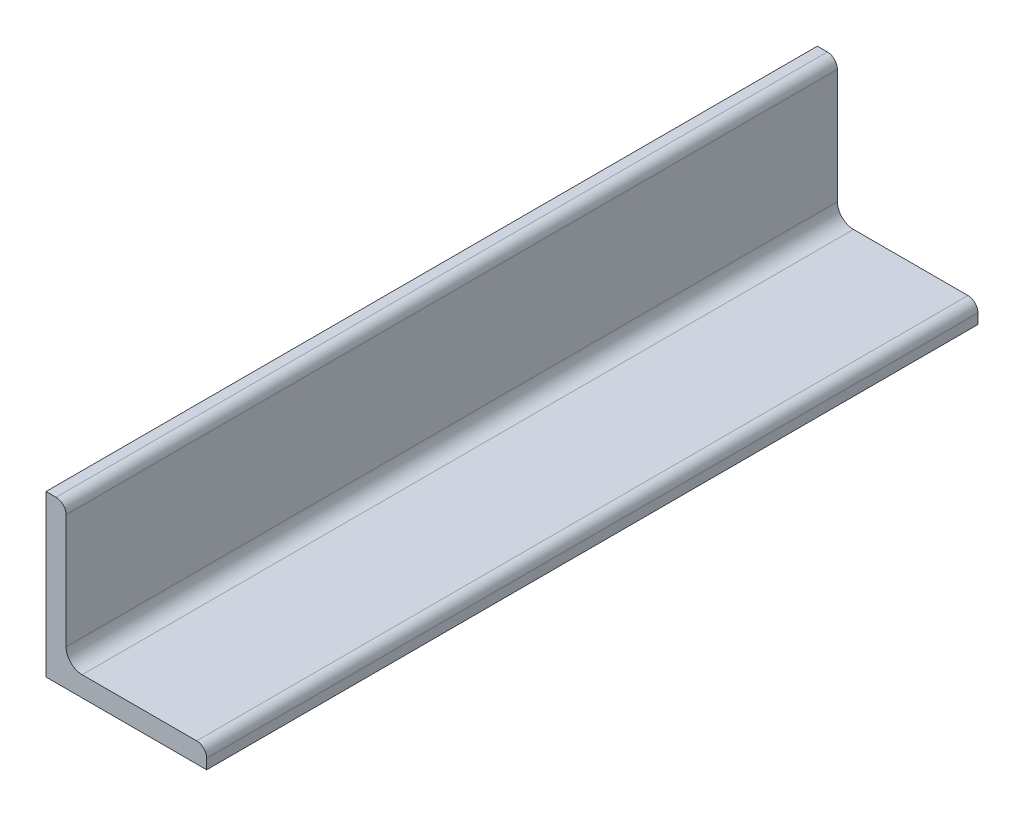
ISO-10303-21;
HEADER;
FILE_DESCRIPTION(('STEP AP214'),'2;1');
FILE_NAME('part.step','',(''),(''),'','','');
FILE_SCHEMA(('AUTOMOTIVE_DESIGN { 1 0 10303 214 1 1 1 1 }'));
ENDSEC;
DATA;
#1=APPLICATION_CONTEXT('core data for automotive mechanical design processes');
#2=APPLICATION_PROTOCOL_DEFINITION('international standard','automotive_design',2000,#1);
#3=PRODUCT_CONTEXT('',#1,'mechanical');
#4=PRODUCT('Part','Part','',(#3));
#5=PRODUCT_RELATED_PRODUCT_CATEGORY('part','',(#4));
#6=PRODUCT_DEFINITION_FORMATION('','',#4);
#7=PRODUCT_DEFINITION_CONTEXT('part definition',#1,'design');
#8=PRODUCT_DEFINITION('design','',#6,#7);
#9=PRODUCT_DEFINITION_SHAPE('','',#8);
#10=(LENGTH_UNIT() NAMED_UNIT(*) SI_UNIT(.MILLI.,.METRE.));
#11=(NAMED_UNIT(*) PLANE_ANGLE_UNIT() SI_UNIT($,.RADIAN.));
#12=(NAMED_UNIT(*) SI_UNIT($,.STERADIAN.) SOLID_ANGLE_UNIT());
#13=UNCERTAINTY_MEASURE_WITH_UNIT(LENGTH_MEASURE(1.E-05),#10,'distance_accuracy_value','');
#14=(GEOMETRIC_REPRESENTATION_CONTEXT(3) GLOBAL_UNCERTAINTY_ASSIGNED_CONTEXT((#13)) GLOBAL_UNIT_ASSIGNED_CONTEXT((#10,
#11,#12)) REPRESENTATION_CONTEXT('',''));
#15=CARTESIAN_POINT('',(0.,0.,0.));
#16=DIRECTION('',(0.,0.,1.));
#17=DIRECTION('',(1.,0.,0.));
#18=AXIS2_PLACEMENT_3D('',#15,#16,#17);
#19=CARTESIAN_POINT('',(0.897927251325018,63.8534276781816,304.8));
#20=DIRECTION('',(1.,0.,0.));
#21=DIRECTION('',(0.,0.,-1.));
#22=AXIS2_PLACEMENT_3D('',#19,#20,#21);
#23=PLANE('',#22);
#24=DIRECTION('',(0.,-1.,0.));
#25=VECTOR('',#24,1.);
#26=CARTESIAN_POINT('',(0.897927251325018,63.8534276781816,0.));
#27=LINE('',#26,#25);
#28=CARTESIAN_POINT('',(0.897927251325018,63.8534276781816,0.));
#29=VERTEX_POINT('',#28);
#30=CARTESIAN_POINT('',(0.897927251325018,0.353427678181561,0.));
#31=VERTEX_POINT('',#30);
#32=EDGE_CURVE('E135',#29,#31,#27,.T.);
#33=ORIENTED_EDGE('',*,*,#32,.T.);
#34=DIRECTION('',(0.,0.,-1.));
#35=VECTOR('',#34,1.);
#36=CARTESIAN_POINT('',(0.897927251325018,0.353427678181561,304.8));
#37=LINE('',#36,#35);
#38=CARTESIAN_POINT('',(0.897927251325018,0.353427678181561,304.8));
#39=VERTEX_POINT('',#38);
#40=EDGE_CURVE('E11',#39,#31,#37,.T.);
#41=ORIENTED_EDGE('',*,*,#40,.F.);
#42=DIRECTION('',(0.,-1.,0.));
#43=VECTOR('',#42,1.);
#44=CARTESIAN_POINT('',(0.897927251325018,63.8534276781816,304.8));
#45=LINE('',#44,#43);
#46=CARTESIAN_POINT('',(0.897927251325018,63.8534276781816,304.8));
#47=VERTEX_POINT('',#46);
#48=EDGE_CURVE('E151',#47,#39,#45,.T.);
#49=ORIENTED_EDGE('',*,*,#48,.F.);
#50=DIRECTION('',(0.,0.,-1.));
#51=VECTOR('',#50,1.);
#52=CARTESIAN_POINT('',(0.897927251325018,63.8534276781816,304.8));
#53=LINE('',#52,#51);
#54=EDGE_CURVE('E131',#47,#29,#53,.T.);
#55=ORIENTED_EDGE('',*,*,#54,.T.);
#56=EDGE_LOOP('',(#33,#41,#49,#55));
#57=FACE_BOUND('',#56,.T.);
#58=ADVANCED_FACE('F33',(#57),#23,.F.);
#59=CARTESIAN_POINT('',(0.897927251325018,0.353427678181561,304.8));
#60=DIRECTION('',(0.,1.,0.));
#61=DIRECTION('',(0.,0.,1.));
#62=AXIS2_PLACEMENT_3D('',#59,#60,#61);
#63=PLANE('',#62);
#64=DIRECTION('',(1.,0.,0.));
#65=VECTOR('',#64,1.);
#66=CARTESIAN_POINT('',(0.897927251325018,0.353427678181561,0.));
#67=LINE('',#66,#65);
#68=CARTESIAN_POINT('',(64.397927251325,0.353427678181561,0.));
#69=VERTEX_POINT('',#68);
#70=EDGE_CURVE('E138',#31,#69,#67,.T.);
#71=ORIENTED_EDGE('',*,*,#70,.T.);
#72=DIRECTION('',(0.,0.,-1.));
#73=VECTOR('',#72,1.);
#74=CARTESIAN_POINT('',(64.397927251325,0.353427678181561,304.8));
#75=LINE('',#74,#73);
#76=CARTESIAN_POINT('',(64.397927251325,0.353427678181561,304.8));
#77=VERTEX_POINT('',#76);
#78=EDGE_CURVE('E41',#77,#69,#75,.T.);
#79=ORIENTED_EDGE('',*,*,#78,.F.);
#80=DIRECTION('',(1.,0.,0.));
#81=VECTOR('',#80,1.);
#82=CARTESIAN_POINT('',(0.897927251325018,0.353427678181561,304.8));
#83=LINE('',#82,#81);
#84=EDGE_CURVE('E95',#39,#77,#83,.T.);
#85=ORIENTED_EDGE('',*,*,#84,.F.);
#86=ORIENTED_EDGE('',*,*,#40,.T.);
#87=EDGE_LOOP('',(#71,#79,#85,#86));
#88=FACE_BOUND('',#87,.T.);
#89=ADVANCED_FACE('F194',(#88),#63,.F.);
#90=CARTESIAN_POINT('',(64.397927251325,0.353427678181561,304.8));
#91=DIRECTION('',(-1.,0.,0.));
#92=DIRECTION('',(0.,0.,1.));
#93=AXIS2_PLACEMENT_3D('',#90,#91,#92);
#94=PLANE('',#93);
#95=DIRECTION('',(0.,1.,0.));
#96=VECTOR('',#95,1.);
#97=CARTESIAN_POINT('',(64.397927251325,0.353427678181561,0.));
#98=LINE('',#97,#96);
#99=CARTESIAN_POINT('',(64.397927251325,4.32217767818156,0.));
#100=VERTEX_POINT('',#99);
#101=EDGE_CURVE('E140',#69,#100,#98,.T.);
#102=ORIENTED_EDGE('',*,*,#101,.T.);
#103=DIRECTION('',(0.,0.,-1.));
#104=VECTOR('',#103,1.);
#105=CARTESIAN_POINT('',(64.397927251325,4.32217767818156,304.8));
#106=LINE('',#105,#104);
#107=CARTESIAN_POINT('',(64.397927251325,4.32217767818156,304.8));
#108=VERTEX_POINT('',#107);
#109=EDGE_CURVE('E161',#108,#100,#106,.T.);
#110=ORIENTED_EDGE('',*,*,#109,.F.);
#111=DIRECTION('',(0.,1.,0.));
#112=VECTOR('',#111,1.);
#113=CARTESIAN_POINT('',(64.397927251325,0.353427678181561,304.8));
#114=LINE('',#113,#112);
#115=EDGE_CURVE('E169',#77,#108,#114,.T.);
#116=ORIENTED_EDGE('',*,*,#115,.F.);
#117=ORIENTED_EDGE('',*,*,#78,.T.);
#118=EDGE_LOOP('',(#102,#110,#116,#117));
#119=FACE_BOUND('',#118,.T.);
#120=ADVANCED_FACE('F167',(#119),#94,.F.);
#121=CARTESIAN_POINT('',(60.429177251325,4.32217767818156,304.8));
#122=DIRECTION('',(0.,0.,-1.));
#123=DIRECTION('',(-1.,0.,0.));
#124=AXIS2_PLACEMENT_3D('',#121,#122,#123);
#125=CYLINDRICAL_SURFACE('',#124,3.96875);
#126=CARTESIAN_POINT('',(60.429177251325,4.32217767818156,0.));
#127=DIRECTION('',(0.,0.,1.));
#128=DIRECTION('',(1.,0.,0.));
#129=AXIS2_PLACEMENT_3D('',#126,#127,#128);
#130=CIRCLE('',#129,3.96875);
#131=CARTESIAN_POINT('',(60.429177251325,8.29092767818156,0.));
#132=VERTEX_POINT('',#131);
#133=EDGE_CURVE('E142',#100,#132,#130,.T.);
#134=ORIENTED_EDGE('',*,*,#133,.T.);
#135=DIRECTION('',(0.,0.,-1.));
#136=VECTOR('',#135,1.);
#137=CARTESIAN_POINT('',(60.429177251325,8.29092767818156,304.8));
#138=LINE('',#137,#136);
#139=CARTESIAN_POINT('',(60.429177251325,8.29092767818156,304.8));
#140=VERTEX_POINT('',#139);
#141=EDGE_CURVE('E158',#140,#132,#138,.T.);
#142=ORIENTED_EDGE('',*,*,#141,.F.);
#143=CARTESIAN_POINT('',(60.429177251325,4.32217767818156,304.8));
#144=DIRECTION('',(0.,0.,1.));
#145=DIRECTION('',(1.,0.,0.));
#146=AXIS2_PLACEMENT_3D('',#143,#144,#145);
#147=CIRCLE('',#146,3.96875);
#148=EDGE_CURVE('E185',#108,#140,#147,.T.);
#149=ORIENTED_EDGE('',*,*,#148,.F.);
#150=ORIENTED_EDGE('',*,*,#109,.T.);
#151=EDGE_LOOP('',(#134,#142,#149,#150));
#152=FACE_BOUND('',#151,.T.);
#153=ADVANCED_FACE('F178',(#152),#125,.T.);
#154=CARTESIAN_POINT('',(60.429177251325,8.29092767818156,304.8));
#155=DIRECTION('',(0.,-1.,0.));
#156=DIRECTION('',(0.,0.,-1.));
#157=AXIS2_PLACEMENT_3D('',#154,#155,#156);
#158=PLANE('',#157);
#159=DIRECTION('',(-1.,0.,0.));
#160=VECTOR('',#159,1.);
#161=CARTESIAN_POINT('',(60.429177251325,8.29092767818156,0.));
#162=LINE('',#161,#160);
#163=CARTESIAN_POINT('',(15.185427251325,8.29092767818156,0.));
#164=VERTEX_POINT('',#163);
#165=EDGE_CURVE('E144',#132,#164,#162,.T.);
#166=ORIENTED_EDGE('',*,*,#165,.T.);
#167=DIRECTION('',(0.,0.,-1.));
#168=VECTOR('',#167,1.);
#169=CARTESIAN_POINT('',(15.185427251325,8.29092767818156,304.8));
#170=LINE('',#169,#168);
#171=CARTESIAN_POINT('',(15.185427251325,8.29092767818156,304.8));
#172=VERTEX_POINT('',#171);
#173=EDGE_CURVE('E155',#172,#164,#170,.T.);
#174=ORIENTED_EDGE('',*,*,#173,.F.);
#175=DIRECTION('',(-1.,0.,0.));
#176=VECTOR('',#175,1.);
#177=CARTESIAN_POINT('',(60.429177251325,8.29092767818156,304.8));
#178=LINE('',#177,#176);
#179=EDGE_CURVE('E184',#140,#172,#178,.T.);
#180=ORIENTED_EDGE('',*,*,#179,.F.);
#181=ORIENTED_EDGE('',*,*,#141,.T.);
#182=EDGE_LOOP('',(#166,#174,#180,#181));
#183=FACE_BOUND('',#182,.T.);
#184=ADVANCED_FACE('F182',(#183),#158,.F.);
#185=CARTESIAN_POINT('',(15.185427251325,14.6409276781816,304.8));
#186=DIRECTION('',(0.,0.,-1.));
#187=DIRECTION('',(-1.,0.,0.));
#188=AXIS2_PLACEMENT_3D('',#185,#186,#187);
#189=CYLINDRICAL_SURFACE('',#188,6.34999999999999);
#190=CARTESIAN_POINT('',(15.185427251325,14.6409276781816,0.));
#191=DIRECTION('',(0.,0.,-1.));
#192=DIRECTION('',(1.,0.,0.));
#193=AXIS2_PLACEMENT_3D('',#190,#191,#192);
#194=CIRCLE('',#193,6.34999999999999);
#195=CARTESIAN_POINT('',(8.83542725132502,14.6409276781816,0.));
#196=VERTEX_POINT('',#195);
#197=EDGE_CURVE('E146',#164,#196,#194,.T.);
#198=ORIENTED_EDGE('',*,*,#197,.T.);
#199=DIRECTION('',(0.,0.,-1.));
#200=VECTOR('',#199,1.);
#201=CARTESIAN_POINT('',(8.83542725132502,14.6409276781816,304.8));
#202=LINE('',#201,#200);
#203=CARTESIAN_POINT('',(8.83542725132502,14.6409276781816,304.8));
#204=VERTEX_POINT('',#203);
#205=EDGE_CURVE('E126',#204,#196,#202,.T.);
#206=ORIENTED_EDGE('',*,*,#205,.F.);
#207=CARTESIAN_POINT('',(15.185427251325,14.6409276781816,304.8));
#208=DIRECTION('',(0.,0.,-1.));
#209=DIRECTION('',(1.,0.,0.));
#210=AXIS2_PLACEMENT_3D('',#207,#208,#209);
#211=CIRCLE('',#210,6.34999999999999);
#212=EDGE_CURVE('E117',#172,#204,#211,.T.);
#213=ORIENTED_EDGE('',*,*,#212,.F.);
#214=ORIENTED_EDGE('',*,*,#173,.T.);
#215=EDGE_LOOP('',(#198,#206,#213,#214));
#216=FACE_BOUND('',#215,.T.);
#217=ADVANCED_FACE('F206',(#216),#189,.F.);
#218=CARTESIAN_POINT('',(8.83542725132502,14.6409276781816,304.8));
#219=DIRECTION('',(-1.,0.,0.));
#220=DIRECTION('',(0.,0.,1.));
#221=AXIS2_PLACEMENT_3D('',#218,#219,#220);
#222=PLANE('',#221);
#223=DIRECTION('',(0.,1.,0.));
#224=VECTOR('',#223,1.);
#225=CARTESIAN_POINT('',(8.83542725132502,14.6409276781816,0.));
#226=LINE('',#225,#224);
#227=CARTESIAN_POINT('',(8.83542725132502,59.8846776781816,0.));
#228=VERTEX_POINT('',#227);
#229=EDGE_CURVE('E125',#196,#228,#226,.T.);
#230=ORIENTED_EDGE('',*,*,#229,.T.);
#231=DIRECTION('',(0.,0.,-1.));
#232=VECTOR('',#231,1.);
#233=CARTESIAN_POINT('',(8.83542725132502,59.8846776781816,304.8));
#234=LINE('',#233,#232);
#235=CARTESIAN_POINT('',(8.83542725132502,59.8846776781816,304.8));
#236=VERTEX_POINT('',#235);
#237=EDGE_CURVE('E122',#236,#228,#234,.T.);
#238=ORIENTED_EDGE('',*,*,#237,.F.);
#239=DIRECTION('',(0.,1.,0.));
#240=VECTOR('',#239,1.);
#241=CARTESIAN_POINT('',(8.83542725132502,14.6409276781816,304.8));
#242=LINE('',#241,#240);
#243=EDGE_CURVE('E111',#204,#236,#242,.T.);
#244=ORIENTED_EDGE('',*,*,#243,.F.);
#245=ORIENTED_EDGE('',*,*,#205,.T.);
#246=EDGE_LOOP('',(#230,#238,#244,#245));
#247=FACE_BOUND('',#246,.T.);
#248=ADVANCED_FACE('F123',(#247),#222,.F.);
#249=CARTESIAN_POINT('',(4.86667725132502,59.8846776781816,304.8));
#250=DIRECTION('',(0.,0.,-1.));
#251=DIRECTION('',(-1.,0.,0.));
#252=AXIS2_PLACEMENT_3D('',#249,#250,#251);
#253=CYLINDRICAL_SURFACE('',#252,3.96875);
#254=CARTESIAN_POINT('',(4.86667725132502,59.8846776781816,0.));
#255=DIRECTION('',(0.,0.,1.));
#256=DIRECTION('',(1.,0.,0.));
#257=AXIS2_PLACEMENT_3D('',#254,#255,#256);
#258=CIRCLE('',#257,3.96875);
#259=CARTESIAN_POINT('',(4.86667725132502,63.8534276781816,0.));
#260=VERTEX_POINT('',#259);
#261=EDGE_CURVE('E81',#228,#260,#258,.T.);
#262=ORIENTED_EDGE('',*,*,#261,.T.);
#263=DIRECTION('',(0.,0.,-1.));
#264=VECTOR('',#263,1.);
#265=CARTESIAN_POINT('',(4.86667725132502,63.8534276781816,304.8));
#266=LINE('',#265,#264);
#267=CARTESIAN_POINT('',(4.86667725132502,63.8534276781816,304.8));
#268=VERTEX_POINT('',#267);
#269=EDGE_CURVE('E127',#268,#260,#266,.T.);
#270=ORIENTED_EDGE('',*,*,#269,.F.);
#271=CARTESIAN_POINT('',(4.86667725132502,59.8846776781816,304.8));
#272=DIRECTION('',(0.,0.,1.));
#273=DIRECTION('',(1.,0.,0.));
#274=AXIS2_PLACEMENT_3D('',#271,#272,#273);
#275=CIRCLE('',#274,3.96875);
#276=EDGE_CURVE('E115',#236,#268,#275,.T.);
#277=ORIENTED_EDGE('',*,*,#276,.F.);
#278=ORIENTED_EDGE('',*,*,#237,.T.);
#279=EDGE_LOOP('',(#262,#270,#277,#278));
#280=FACE_BOUND('',#279,.T.);
#281=ADVANCED_FACE('F129',(#280),#253,.T.);
#282=CARTESIAN_POINT('',(4.86667725132502,63.8534276781816,304.8));
#283=DIRECTION('',(0.,-1.,0.));
#284=DIRECTION('',(0.,0.,-1.));
#285=AXIS2_PLACEMENT_3D('',#282,#283,#284);
#286=PLANE('',#285);
#287=DIRECTION('',(-1.,0.,0.));
#288=VECTOR('',#287,1.);
#289=CARTESIAN_POINT('',(4.86667725132502,63.8534276781816,0.));
#290=LINE('',#289,#288);
#291=EDGE_CURVE('E87',#260,#29,#290,.T.);
#292=ORIENTED_EDGE('',*,*,#291,.T.);
#293=ORIENTED_EDGE('',*,*,#54,.F.);
#294=DIRECTION('',(-1.,0.,0.));
#295=VECTOR('',#294,1.);
#296=CARTESIAN_POINT('',(4.86667725132502,63.8534276781816,304.8));
#297=LINE('',#296,#295);
#298=EDGE_CURVE('E49',#268,#47,#297,.T.);
#299=ORIENTED_EDGE('',*,*,#298,.F.);
#300=ORIENTED_EDGE('',*,*,#269,.T.);
#301=EDGE_LOOP('',(#292,#293,#299,#300));
#302=FACE_BOUND('',#301,.T.);
#303=ADVANCED_FACE('F214',(#302),#286,.F.);
#304=CARTESIAN_POINT('',(60.429177251325,4.32217767818156,304.8));
#305=DIRECTION('',(0.,0.,1.));
#306=DIRECTION('',(1.,0.,0.));
#307=AXIS2_PLACEMENT_3D('',#304,#305,#306);
#308=PLANE('',#307);
#309=ORIENTED_EDGE('',*,*,#48,.T.);
#310=ORIENTED_EDGE('',*,*,#84,.T.);
#311=ORIENTED_EDGE('',*,*,#115,.T.);
#312=ORIENTED_EDGE('',*,*,#148,.T.);
#313=ORIENTED_EDGE('',*,*,#179,.T.);
#314=ORIENTED_EDGE('',*,*,#212,.T.);
#315=ORIENTED_EDGE('',*,*,#243,.T.);
#316=ORIENTED_EDGE('',*,*,#276,.T.);
#317=ORIENTED_EDGE('',*,*,#298,.T.);
#318=EDGE_LOOP('',(#309,#310,#311,#312,#313,#314,#315,#316,#317));
#319=FACE_BOUND('',#318,.T.);
#320=ADVANCED_FACE('F113',(#319),#308,.T.);
#321=CARTESIAN_POINT('',(60.429177251325,4.32217767818156,0.));
#322=DIRECTION('',(0.,0.,1.));
#323=DIRECTION('',(1.,0.,0.));
#324=AXIS2_PLACEMENT_3D('',#321,#322,#323);
#325=PLANE('',#324);
#326=ORIENTED_EDGE('',*,*,#32,.F.);
#327=ORIENTED_EDGE('',*,*,#291,.F.);
#328=ORIENTED_EDGE('',*,*,#261,.F.);
#329=ORIENTED_EDGE('',*,*,#229,.F.);
#330=ORIENTED_EDGE('',*,*,#197,.F.);
#331=ORIENTED_EDGE('',*,*,#165,.F.);
#332=ORIENTED_EDGE('',*,*,#133,.F.);
#333=ORIENTED_EDGE('',*,*,#101,.F.);
#334=ORIENTED_EDGE('',*,*,#70,.F.);
#335=EDGE_LOOP('',(#326,#327,#328,#329,#330,#331,#332,#333,#334));
#336=FACE_BOUND('',#335,.T.);
#337=ADVANCED_FACE('F173',(#336),#325,.F.);
#338=CLOSED_SHELL('',(#58,#89,#120,#153,#184,#217,#248,#281,#303,#320,#337));
#339=MANIFOLD_SOLID_BREP('B2',#338);
#340=ADVANCED_BREP_SHAPE_REPRESENTATION('',(#18,#339),#14);
#341=SHAPE_DEFINITION_REPRESENTATION(#9,#340);
ENDSEC;
END-ISO-10303-21;
